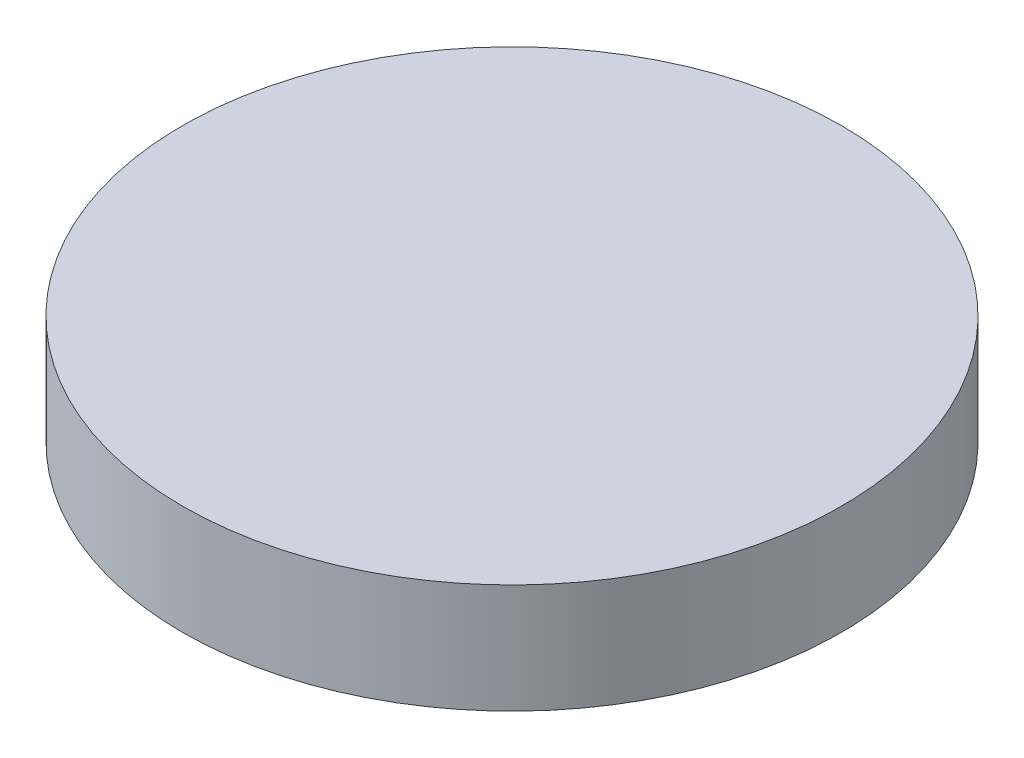
ISO-10303-21;
HEADER;
FILE_DESCRIPTION(('STEP AP214'),'2;1');
FILE_NAME('part.step','',(''),(''),'','','');
FILE_SCHEMA(('AUTOMOTIVE_DESIGN { 1 0 10303 214 1 1 1 1 }'));
ENDSEC;
DATA;
#1=APPLICATION_CONTEXT('core data for automotive mechanical design processes');
#2=APPLICATION_PROTOCOL_DEFINITION('international standard','automotive_design',2000,#1);
#3=PRODUCT_CONTEXT('',#1,'mechanical');
#4=PRODUCT('Part','Part','',(#3));
#5=PRODUCT_RELATED_PRODUCT_CATEGORY('part','',(#4));
#6=PRODUCT_DEFINITION_FORMATION('','',#4);
#7=PRODUCT_DEFINITION_CONTEXT('part definition',#1,'design');
#8=PRODUCT_DEFINITION('design','',#6,#7);
#9=PRODUCT_DEFINITION_SHAPE('','',#8);
#10=(LENGTH_UNIT() NAMED_UNIT(*) SI_UNIT(.MILLI.,.METRE.));
#11=(NAMED_UNIT(*) PLANE_ANGLE_UNIT() SI_UNIT($,.RADIAN.));
#12=(NAMED_UNIT(*) SI_UNIT($,.STERADIAN.) SOLID_ANGLE_UNIT());
#13=UNCERTAINTY_MEASURE_WITH_UNIT(LENGTH_MEASURE(1.E-05),#10,'distance_accuracy_value','');
#14=(GEOMETRIC_REPRESENTATION_CONTEXT(3) GLOBAL_UNCERTAINTY_ASSIGNED_CONTEXT((#13)) GLOBAL_UNIT_ASSIGNED_CONTEXT((#10,
#11,#12)) REPRESENTATION_CONTEXT('',''));
#15=CARTESIAN_POINT('',(0.,0.,0.));
#16=DIRECTION('',(0.,0.,1.));
#17=DIRECTION('',(1.,0.,0.));
#18=AXIS2_PLACEMENT_3D('',#15,#16,#17);
#19=CARTESIAN_POINT('',(0.,1.65,0.));
#20=DIRECTION('',(0.,-1.,0.));
#21=DIRECTION('',(0.,0.,-1.));
#22=AXIS2_PLACEMENT_3D('',#19,#20,#21);
#23=CYLINDRICAL_SURFACE('',#22,4.975);
#24=CARTESIAN_POINT('',(0.,1.65,0.));
#25=DIRECTION('',(0.,1.,0.));
#26=DIRECTION('',(0.,0.,1.));
#27=AXIS2_PLACEMENT_3D('',#24,#25,#26);
#28=CIRCLE('',#27,4.975);
#29=CARTESIAN_POINT('',(0.,1.65,4.975));
#30=VERTEX_POINT('',#29);
#31=EDGE_CURVE('E10',#30,#30,#28,.T.);
#32=ORIENTED_EDGE('',*,*,#31,.F.);
#33=EDGE_LOOP('',(#32));
#34=FACE_BOUND('',#33,.T.);
#35=CARTESIAN_POINT('',(0.,0.,0.));
#36=DIRECTION('',(0.,1.,0.));
#37=DIRECTION('',(0.,0.,1.));
#38=AXIS2_PLACEMENT_3D('',#35,#36,#37);
#39=CIRCLE('',#38,4.975);
#40=CARTESIAN_POINT('',(0.,0.,4.975));
#41=VERTEX_POINT('',#40);
#42=EDGE_CURVE('E42',#41,#41,#39,.T.);
#43=ORIENTED_EDGE('',*,*,#42,.T.);
#44=EDGE_LOOP('',(#43));
#45=FACE_BOUND('',#44,.T.);
#46=ADVANCED_FACE('F39',(#34,#45),#23,.T.);
#47=CARTESIAN_POINT('',(0.,1.65,0.));
#48=DIRECTION('',(0.,1.,0.));
#49=DIRECTION('',(0.,0.,1.));
#50=AXIS2_PLACEMENT_3D('',#47,#48,#49);
#51=PLANE('',#50);
#52=ORIENTED_EDGE('',*,*,#31,.T.);
#53=EDGE_LOOP('',(#52));
#54=FACE_BOUND('',#53,.T.);
#55=ADVANCED_FACE('F54',(#54),#51,.T.);
#56=CARTESIAN_POINT('',(0.,0.,0.));
#57=DIRECTION('',(0.,1.,0.));
#58=DIRECTION('',(0.,0.,1.));
#59=AXIS2_PLACEMENT_3D('',#56,#57,#58);
#60=PLANE('',#59);
#61=ORIENTED_EDGE('',*,*,#42,.F.);
#62=EDGE_LOOP('',(#61));
#63=FACE_BOUND('',#62,.T.);
#64=ADVANCED_FACE('F52',(#63),#60,.F.);
#65=CLOSED_SHELL('',(#46,#55,#64));
#66=MANIFOLD_SOLID_BREP('B2',#65);
#67=ADVANCED_BREP_SHAPE_REPRESENTATION('',(#18,#66),#14);
#68=SHAPE_DEFINITION_REPRESENTATION(#9,#67);
ENDSEC;
END-ISO-10303-21;
